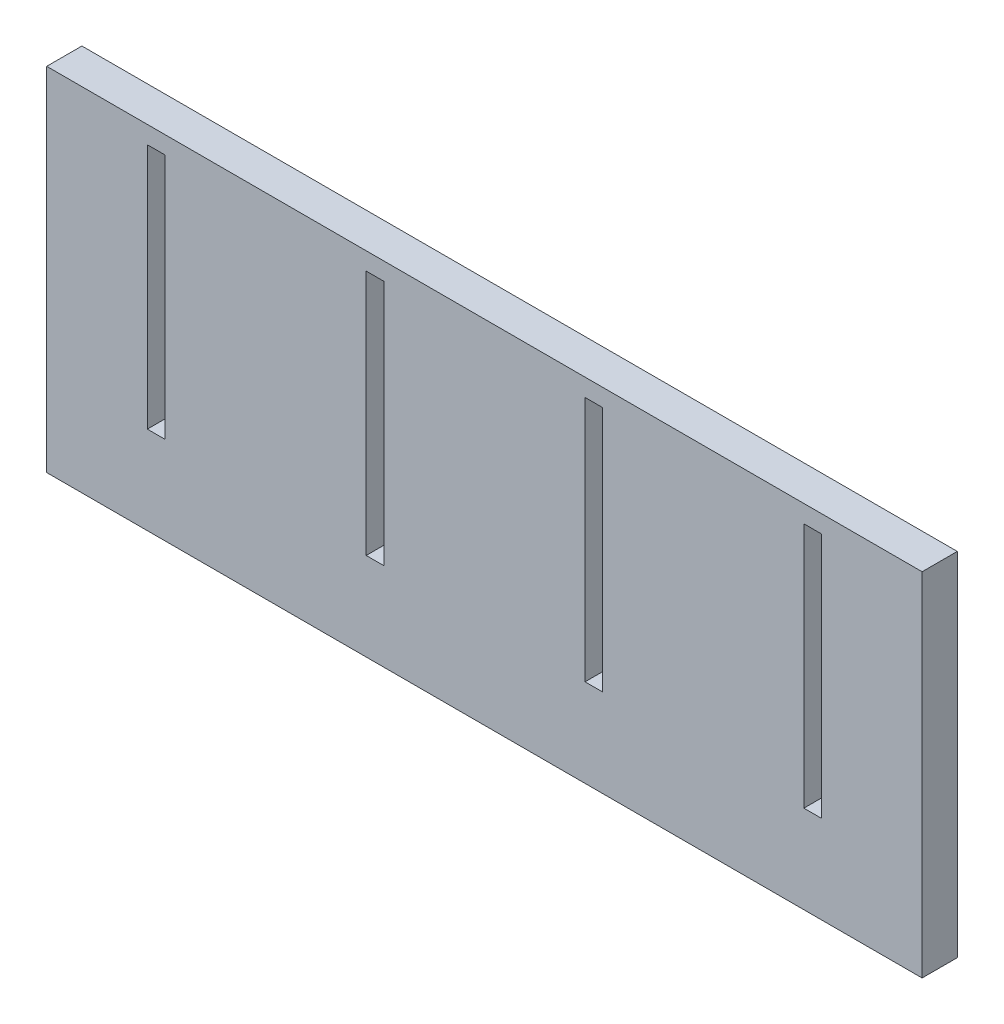
ISO-10303-21;
HEADER;
FILE_DESCRIPTION(('STEP AP214'),'2;1');
FILE_NAME('part.step','',(''),(''),'','','');
FILE_SCHEMA(('AUTOMOTIVE_DESIGN { 1 0 10303 214 1 1 1 1 }'));
ENDSEC;
DATA;
#1=APPLICATION_CONTEXT('core data for automotive mechanical design processes');
#2=APPLICATION_PROTOCOL_DEFINITION('international standard','automotive_design',2000,#1);
#3=PRODUCT_CONTEXT('',#1,'mechanical');
#4=PRODUCT('Part','Part','',(#3));
#5=PRODUCT_RELATED_PRODUCT_CATEGORY('part','',(#4));
#6=PRODUCT_DEFINITION_FORMATION('','',#4);
#7=PRODUCT_DEFINITION_CONTEXT('part definition',#1,'design');
#8=PRODUCT_DEFINITION('design','',#6,#7);
#9=PRODUCT_DEFINITION_SHAPE('','',#8);
#10=(LENGTH_UNIT() NAMED_UNIT(*) SI_UNIT(.MILLI.,.METRE.));
#11=(NAMED_UNIT(*) PLANE_ANGLE_UNIT() SI_UNIT($,.RADIAN.));
#12=(NAMED_UNIT(*) SI_UNIT($,.STERADIAN.) SOLID_ANGLE_UNIT());
#13=UNCERTAINTY_MEASURE_WITH_UNIT(LENGTH_MEASURE(1.E-05),#10,'distance_accuracy_value','');
#14=(GEOMETRIC_REPRESENTATION_CONTEXT(3) GLOBAL_UNCERTAINTY_ASSIGNED_CONTEXT((#13)) GLOBAL_UNIT_ASSIGNED_CONTEXT((#10,
#11,#12)) REPRESENTATION_CONTEXT('',''));
#15=CARTESIAN_POINT('',(0.,0.,0.));
#16=DIRECTION('',(0.,0.,1.));
#17=DIRECTION('',(1.,0.,0.));
#18=AXIS2_PLACEMENT_3D('',#15,#16,#17);
#19=CARTESIAN_POINT('',(33.6070185223817,0.,10.));
#20=DIRECTION('',(1.,0.,0.));
#21=DIRECTION('',(0.,0.,-1.));
#22=AXIS2_PLACEMENT_3D('',#19,#20,#21);
#23=PLANE('',#22);
#24=DIRECTION('',(0.,-1.,0.));
#25=VECTOR('',#24,1.);
#26=CARTESIAN_POINT('',(33.6070185223817,0.,0.));
#27=LINE('',#26,#25);
#28=CARTESIAN_POINT('',(33.6070185223817,-20.7839218912192,0.));
#29=VERTEX_POINT('',#28);
#30=CARTESIAN_POINT('',(33.6070185223817,-90.7839218912192,0.));
#31=VERTEX_POINT('',#30);
#32=EDGE_CURVE('E285',#29,#31,#27,.T.);
#33=ORIENTED_EDGE('',*,*,#32,.T.);
#34=DIRECTION('',(0.,0.,-1.));
#35=VECTOR('',#34,1.);
#36=CARTESIAN_POINT('',(33.6070185223817,-90.7839218912192,10.));
#37=LINE('',#36,#35);
#38=CARTESIAN_POINT('',(33.6070185223817,-90.7839218912192,10.));
#39=VERTEX_POINT('',#38);
#40=EDGE_CURVE('E11',#39,#31,#37,.T.);
#41=ORIENTED_EDGE('',*,*,#40,.F.);
#42=DIRECTION('',(0.,-1.,0.));
#43=VECTOR('',#42,1.);
#44=CARTESIAN_POINT('',(33.6070185223817,0.,10.));
#45=LINE('',#44,#43);
#46=CARTESIAN_POINT('',(33.6070185223817,-20.7839218912192,10.));
#47=VERTEX_POINT('',#46);
#48=EDGE_CURVE('E199',#47,#39,#45,.T.);
#49=ORIENTED_EDGE('',*,*,#48,.F.);
#50=DIRECTION('',(0.,0.,-1.));
#51=VECTOR('',#50,1.);
#52=CARTESIAN_POINT('',(33.6070185223817,-20.7839218912192,10.));
#53=LINE('',#52,#51);
#54=EDGE_CURVE('E67',#47,#29,#53,.T.);
#55=ORIENTED_EDGE('',*,*,#54,.T.);
#56=EDGE_LOOP('',(#33,#41,#49,#55));
#57=FACE_BOUND('',#56,.T.);
#58=ADVANCED_FACE('F47',(#57),#23,.F.);
#59=CARTESIAN_POINT('',(0.,-90.7839218912192,10.));
#60=DIRECTION('',(0.,-1.,0.));
#61=DIRECTION('',(0.,0.,-1.));
#62=AXIS2_PLACEMENT_3D('',#59,#60,#61);
#63=PLANE('',#62);
#64=DIRECTION('',(-1.,0.,0.));
#65=VECTOR('',#64,1.);
#66=CARTESIAN_POINT('',(0.,-90.7839218912192,0.));
#67=LINE('',#66,#65);
#68=CARTESIAN_POINT('',(28.6070185223817,-90.7839218912192,0.));
#69=VERTEX_POINT('',#68);
#70=EDGE_CURVE('E206',#31,#69,#67,.T.);
#71=ORIENTED_EDGE('',*,*,#70,.T.);
#72=DIRECTION('',(0.,0.,-1.));
#73=VECTOR('',#72,1.);
#74=CARTESIAN_POINT('',(28.6070185223817,-90.7839218912192,10.));
#75=LINE('',#74,#73);
#76=CARTESIAN_POINT('',(28.6070185223817,-90.7839218912192,10.));
#77=VERTEX_POINT('',#76);
#78=EDGE_CURVE('E58',#77,#69,#75,.T.);
#79=ORIENTED_EDGE('',*,*,#78,.F.);
#80=DIRECTION('',(-1.,0.,0.));
#81=VECTOR('',#80,1.);
#82=CARTESIAN_POINT('',(0.,-90.7839218912192,10.));
#83=LINE('',#82,#81);
#84=EDGE_CURVE('E193',#39,#77,#83,.T.);
#85=ORIENTED_EDGE('',*,*,#84,.F.);
#86=ORIENTED_EDGE('',*,*,#40,.T.);
#87=EDGE_LOOP('',(#71,#79,#85,#86));
#88=FACE_BOUND('',#87,.T.);
#89=ADVANCED_FACE('F205',(#88),#63,.F.);
#90=CARTESIAN_POINT('',(28.6070185223817,0.,10.));
#91=DIRECTION('',(1.,0.,0.));
#92=DIRECTION('',(0.,1.,0.));
#93=AXIS2_PLACEMENT_3D('',#90,#91,#92);
#94=PLANE('',#93);
#95=DIRECTION('',(0.,-1.,0.));
#96=VECTOR('',#95,1.);
#97=CARTESIAN_POINT('',(28.6070185223817,0.,0.));
#98=LINE('',#97,#96);
#99=CARTESIAN_POINT('',(28.6070185223817,-20.7839218912192,0.));
#100=VERTEX_POINT('',#99);
#101=EDGE_CURVE('E290',#100,#69,#98,.T.);
#102=ORIENTED_EDGE('',*,*,#101,.F.);
#103=DIRECTION('',(0.,0.,-1.));
#104=VECTOR('',#103,1.);
#105=CARTESIAN_POINT('',(28.6070185223817,-20.7839218912192,10.));
#106=LINE('',#105,#104);
#107=CARTESIAN_POINT('',(28.6070185223817,-20.7839218912192,10.));
#108=VERTEX_POINT('',#107);
#109=EDGE_CURVE('E129',#108,#100,#106,.T.);
#110=ORIENTED_EDGE('',*,*,#109,.F.);
#111=DIRECTION('',(0.,-1.,0.));
#112=VECTOR('',#111,1.);
#113=CARTESIAN_POINT('',(28.6070185223817,0.,10.));
#114=LINE('',#113,#112);
#115=EDGE_CURVE('E198',#108,#77,#114,.T.);
#116=ORIENTED_EDGE('',*,*,#115,.T.);
#117=ORIENTED_EDGE('',*,*,#78,.T.);
#118=EDGE_LOOP('',(#102,#110,#116,#117));
#119=FACE_BOUND('',#118,.T.);
#120=ADVANCED_FACE('F211',(#119),#94,.T.);
#121=CARTESIAN_POINT('',(0.,-115.783921891219,10.));
#122=DIRECTION('',(0.,1.,0.));
#123=DIRECTION('',(0.,0.,1.));
#124=AXIS2_PLACEMENT_3D('',#121,#122,#123);
#125=PLANE('',#124);
#126=DIRECTION('',(1.,0.,0.));
#127=VECTOR('',#126,1.);
#128=CARTESIAN_POINT('',(0.,-115.783921891219,0.));
#129=LINE('',#128,#127);
#130=CARTESIAN_POINT('',(-124.392981477618,-115.783921891219,0.));
#131=VERTEX_POINT('',#130);
#132=CARTESIAN_POINT('',(124.407018522382,-115.783921891219,0.));
#133=VERTEX_POINT('',#132);
#134=EDGE_CURVE('E269',#131,#133,#129,.T.);
#135=ORIENTED_EDGE('',*,*,#134,.T.);
#136=DIRECTION('',(0.,0.,-1.));
#137=VECTOR('',#136,1.);
#138=CARTESIAN_POINT('',(124.407018522382,-115.783921891219,10.));
#139=LINE('',#138,#137);
#140=CARTESIAN_POINT('',(124.407018522382,-115.783921891219,10.));
#141=VERTEX_POINT('',#140);
#142=EDGE_CURVE('E300',#141,#133,#139,.T.);
#143=ORIENTED_EDGE('',*,*,#142,.F.);
#144=DIRECTION('',(1.,0.,0.));
#145=VECTOR('',#144,1.);
#146=CARTESIAN_POINT('',(0.,-115.783921891219,10.));
#147=LINE('',#146,#145);
#148=CARTESIAN_POINT('',(-124.392981477618,-115.783921891219,10.));
#149=VERTEX_POINT('',#148);
#150=EDGE_CURVE('E413',#149,#141,#147,.T.);
#151=ORIENTED_EDGE('',*,*,#150,.F.);
#152=DIRECTION('',(0.,0.,-1.));
#153=VECTOR('',#152,1.);
#154=CARTESIAN_POINT('',(-124.392981477618,-115.783921891219,10.));
#155=LINE('',#154,#153);
#156=EDGE_CURVE('E303',#149,#131,#155,.T.);
#157=ORIENTED_EDGE('',*,*,#156,.T.);
#158=EDGE_LOOP('',(#135,#143,#151,#157));
#159=FACE_BOUND('',#158,.T.);
#160=ADVANCED_FACE('F521',(#159),#125,.F.);
#161=CARTESIAN_POINT('',(124.407018522382,0.,10.));
#162=DIRECTION('',(-1.,0.,0.));
#163=DIRECTION('',(0.,0.,1.));
#164=AXIS2_PLACEMENT_3D('',#161,#162,#163);
#165=PLANE('',#164);
#166=DIRECTION('',(0.,1.,0.));
#167=VECTOR('',#166,1.);
#168=CARTESIAN_POINT('',(124.407018522382,0.,0.));
#169=LINE('',#168,#167);
#170=CARTESIAN_POINT('',(124.407018522382,-15.7839218912193,0.));
#171=VERTEX_POINT('',#170);
#172=EDGE_CURVE('E273',#133,#171,#169,.T.);
#173=ORIENTED_EDGE('',*,*,#172,.T.);
#174=DIRECTION('',(0.,0.,-1.));
#175=VECTOR('',#174,1.);
#176=CARTESIAN_POINT('',(124.407018522382,-15.7839218912193,10.));
#177=LINE('',#176,#175);
#178=CARTESIAN_POINT('',(124.407018522382,-15.7839218912193,10.));
#179=VERTEX_POINT('',#178);
#180=EDGE_CURVE('E310',#179,#171,#177,.T.);
#181=ORIENTED_EDGE('',*,*,#180,.F.);
#182=DIRECTION('',(0.,1.,0.));
#183=VECTOR('',#182,1.);
#184=CARTESIAN_POINT('',(124.407018522382,0.,10.));
#185=LINE('',#184,#183);
#186=EDGE_CURVE('E417',#141,#179,#185,.T.);
#187=ORIENTED_EDGE('',*,*,#186,.F.);
#188=ORIENTED_EDGE('',*,*,#142,.T.);
#189=EDGE_LOOP('',(#173,#181,#187,#188));
#190=FACE_BOUND('',#189,.T.);
#191=ADVANCED_FACE('F524',(#190),#165,.F.);
#192=CARTESIAN_POINT('',(0.,-15.7839218912193,10.));
#193=DIRECTION('',(0.,1.,0.));
#194=DIRECTION('',(0.,0.,1.));
#195=AXIS2_PLACEMENT_3D('',#192,#193,#194);
#196=PLANE('',#195);
#197=DIRECTION('',(1.,0.,0.));
#198=VECTOR('',#197,1.);
#199=CARTESIAN_POINT('',(0.,-15.7839218912193,0.));
#200=LINE('',#199,#198);
#201=CARTESIAN_POINT('',(-124.392981477618,-15.7839218912193,0.));
#202=VERTEX_POINT('',#201);
#203=EDGE_CURVE('E277',#202,#171,#200,.T.);
#204=ORIENTED_EDGE('',*,*,#203,.F.);
#205=DIRECTION('',(0.,0.,-1.));
#206=VECTOR('',#205,1.);
#207=CARTESIAN_POINT('',(-124.392981477618,-15.7839218912193,10.));
#208=LINE('',#207,#206);
#209=CARTESIAN_POINT('',(-124.392981477618,-15.7839218912193,10.));
#210=VERTEX_POINT('',#209);
#211=EDGE_CURVE('E306',#210,#202,#208,.T.);
#212=ORIENTED_EDGE('',*,*,#211,.F.);
#213=DIRECTION('',(1.,0.,0.));
#214=VECTOR('',#213,1.);
#215=CARTESIAN_POINT('',(0.,-15.7839218912193,10.));
#216=LINE('',#215,#214);
#217=EDGE_CURVE('E420',#210,#179,#216,.T.);
#218=ORIENTED_EDGE('',*,*,#217,.T.);
#219=ORIENTED_EDGE('',*,*,#180,.T.);
#220=EDGE_LOOP('',(#204,#212,#218,#219));
#221=FACE_BOUND('',#220,.T.);
#222=ADVANCED_FACE('F527',(#221),#196,.T.);
#223=CARTESIAN_POINT('',(-95.7929814776183,0.,10.));
#224=DIRECTION('',(1.,0.,0.));
#225=DIRECTION('',(0.,0.,-1.));
#226=AXIS2_PLACEMENT_3D('',#223,#224,#225);
#227=PLANE('',#226);
#228=DIRECTION('',(0.,-1.,0.));
#229=VECTOR('',#228,1.);
#230=CARTESIAN_POINT('',(-95.7929814776183,0.,0.));
#231=LINE('',#230,#229);
#232=CARTESIAN_POINT('',(-95.7929814776183,-20.7839218912192,0.));
#233=VERTEX_POINT('',#232);
#234=CARTESIAN_POINT('',(-95.7929814776183,-90.7839218912193,0.));
#235=VERTEX_POINT('',#234);
#236=EDGE_CURVE('E253',#233,#235,#231,.T.);
#237=ORIENTED_EDGE('',*,*,#236,.F.);
#238=DIRECTION('',(0.,0.,-1.));
#239=VECTOR('',#238,1.);
#240=CARTESIAN_POINT('',(-95.7929814776183,-20.7839218912192,10.));
#241=LINE('',#240,#239);
#242=CARTESIAN_POINT('',(-95.7929814776183,-20.7839218912192,10.));
#243=VERTEX_POINT('',#242);
#244=EDGE_CURVE('E307',#243,#233,#241,.T.);
#245=ORIENTED_EDGE('',*,*,#244,.F.);
#246=DIRECTION('',(0.,-1.,0.));
#247=VECTOR('',#246,1.);
#248=CARTESIAN_POINT('',(-95.7929814776183,0.,10.));
#249=LINE('',#248,#247);
#250=CARTESIAN_POINT('',(-95.7929814776183,-90.7839218912193,10.));
#251=VERTEX_POINT('',#250);
#252=EDGE_CURVE('E398',#243,#251,#249,.T.);
#253=ORIENTED_EDGE('',*,*,#252,.T.);
#254=DIRECTION('',(0.,0.,-1.));
#255=VECTOR('',#254,1.);
#256=CARTESIAN_POINT('',(-95.7929814776183,-90.7839218912193,10.));
#257=LINE('',#256,#255);
#258=EDGE_CURVE('E316',#251,#235,#257,.T.);
#259=ORIENTED_EDGE('',*,*,#258,.T.);
#260=EDGE_LOOP('',(#237,#245,#253,#259));
#261=FACE_BOUND('',#260,.T.);
#262=ADVANCED_FACE('F555',(#261),#227,.T.);
#263=CARTESIAN_POINT('',(0.,-20.7839218912192,10.));
#264=DIRECTION('',(0.,-1.,0.));
#265=DIRECTION('',(0.,0.,-1.));
#266=AXIS2_PLACEMENT_3D('',#263,#264,#265);
#267=PLANE('',#266);
#268=DIRECTION('',(-1.,0.,0.));
#269=VECTOR('',#268,1.);
#270=CARTESIAN_POINT('',(0.,-20.7839218912192,0.));
#271=LINE('',#270,#269);
#272=CARTESIAN_POINT('',(-90.7929814776183,-20.7839218912192,0.));
#273=VERTEX_POINT('',#272);
#274=EDGE_CURVE('E257',#273,#233,#271,.T.);
#275=ORIENTED_EDGE('',*,*,#274,.F.);
#276=DIRECTION('',(0.,0.,-1.));
#277=VECTOR('',#276,1.);
#278=CARTESIAN_POINT('',(-90.7929814776183,-20.7839218912192,10.));
#279=LINE('',#278,#277);
#280=CARTESIAN_POINT('',(-90.7929814776183,-20.7839218912192,10.));
#281=VERTEX_POINT('',#280);
#282=EDGE_CURVE('E324',#281,#273,#279,.T.);
#283=ORIENTED_EDGE('',*,*,#282,.F.);
#284=DIRECTION('',(-1.,0.,0.));
#285=VECTOR('',#284,1.);
#286=CARTESIAN_POINT('',(0.,-20.7839218912192,10.));
#287=LINE('',#286,#285);
#288=EDGE_CURVE('E402',#281,#243,#287,.T.);
#289=ORIENTED_EDGE('',*,*,#288,.T.);
#290=ORIENTED_EDGE('',*,*,#244,.T.);
#291=EDGE_LOOP('',(#275,#283,#289,#290));
#292=FACE_BOUND('',#291,.T.);
#293=ADVANCED_FACE('F567',(#292),#267,.T.);
#294=CARTESIAN_POINT('',(-90.7929814776183,0.,10.));
#295=DIRECTION('',(1.,0.,0.));
#296=DIRECTION('',(0.,1.,0.));
#297=AXIS2_PLACEMENT_3D('',#294,#295,#296);
#298=PLANE('',#297);
#299=DIRECTION('',(0.,-1.,0.));
#300=VECTOR('',#299,1.);
#301=CARTESIAN_POINT('',(-90.7929814776183,0.,0.));
#302=LINE('',#301,#300);
#303=CARTESIAN_POINT('',(-90.7929814776183,-90.7839218912193,0.));
#304=VERTEX_POINT('',#303);
#305=EDGE_CURVE('E261',#273,#304,#302,.T.);
#306=ORIENTED_EDGE('',*,*,#305,.T.);
#307=DIRECTION('',(0.,0.,-1.));
#308=VECTOR('',#307,1.);
#309=CARTESIAN_POINT('',(-90.7929814776183,-90.7839218912193,10.));
#310=LINE('',#309,#308);
#311=CARTESIAN_POINT('',(-90.7929814776183,-90.7839218912193,10.));
#312=VERTEX_POINT('',#311);
#313=EDGE_CURVE('E319',#312,#304,#310,.T.);
#314=ORIENTED_EDGE('',*,*,#313,.F.);
#315=DIRECTION('',(0.,-1.,0.));
#316=VECTOR('',#315,1.);
#317=CARTESIAN_POINT('',(-90.7929814776183,0.,10.));
#318=LINE('',#317,#316);
#319=EDGE_CURVE('E406',#281,#312,#318,.T.);
#320=ORIENTED_EDGE('',*,*,#319,.F.);
#321=ORIENTED_EDGE('',*,*,#282,.T.);
#322=EDGE_LOOP('',(#306,#314,#320,#321));
#323=FACE_BOUND('',#322,.T.);
#324=ADVANCED_FACE('F563',(#323),#298,.F.);
#325=CARTESIAN_POINT('',(-28.5929814776183,0.,10.));
#326=DIRECTION('',(-1.,0.,0.));
#327=DIRECTION('',(0.,0.,1.));
#328=AXIS2_PLACEMENT_3D('',#325,#326,#327);
#329=PLANE('',#328);
#330=DIRECTION('',(0.,1.,0.));
#331=VECTOR('',#330,1.);
#332=CARTESIAN_POINT('',(-28.5929814776183,0.,0.));
#333=LINE('',#332,#331);
#334=CARTESIAN_POINT('',(-28.5929814776183,-90.7839218912192,0.));
#335=VERTEX_POINT('',#334);
#336=CARTESIAN_POINT('',(-28.5929814776183,-20.7839218912192,0.));
#337=VERTEX_POINT('',#336);
#338=EDGE_CURVE('E237',#335,#337,#333,.T.);
#339=ORIENTED_EDGE('',*,*,#338,.F.);
#340=DIRECTION('',(0.,0.,-1.));
#341=VECTOR('',#340,1.);
#342=CARTESIAN_POINT('',(-28.5929814776183,-90.7839218912192,10.));
#343=LINE('',#342,#341);
#344=CARTESIAN_POINT('',(-28.5929814776183,-90.7839218912192,10.));
#345=VERTEX_POINT('',#344);
#346=EDGE_CURVE('E320',#345,#335,#343,.T.);
#347=ORIENTED_EDGE('',*,*,#346,.F.);
#348=DIRECTION('',(0.,1.,0.));
#349=VECTOR('',#348,1.);
#350=CARTESIAN_POINT('',(-28.5929814776183,0.,10.));
#351=LINE('',#350,#349);
#352=CARTESIAN_POINT('',(-28.5929814776183,-20.7839218912192,10.));
#353=VERTEX_POINT('',#352);
#354=EDGE_CURVE('E375',#345,#353,#351,.T.);
#355=ORIENTED_EDGE('',*,*,#354,.T.);
#356=DIRECTION('',(0.,0.,-1.));
#357=VECTOR('',#356,1.);
#358=CARTESIAN_POINT('',(-28.5929814776183,-20.7839218912192,10.));
#359=LINE('',#358,#357);
#360=EDGE_CURVE('E329',#353,#337,#359,.T.);
#361=ORIENTED_EDGE('',*,*,#360,.T.);
#362=EDGE_LOOP('',(#339,#347,#355,#361));
#363=FACE_BOUND('',#362,.T.);
#364=ADVANCED_FACE('F566',(#363),#329,.T.);
#365=CARTESIAN_POINT('',(0.,-90.7839218912192,10.));
#366=DIRECTION('',(0.,1.,0.));
#367=DIRECTION('',(0.,0.,1.));
#368=AXIS2_PLACEMENT_3D('',#365,#366,#367);
#369=PLANE('',#368);
#370=DIRECTION('',(1.,0.,0.));
#371=VECTOR('',#370,1.);
#372=CARTESIAN_POINT('',(0.,-90.7839218912192,0.));
#373=LINE('',#372,#371);
#374=CARTESIAN_POINT('',(-33.5929814776183,-90.7839218912192,0.));
#375=VERTEX_POINT('',#374);
#376=EDGE_CURVE('E241',#375,#335,#373,.T.);
#377=ORIENTED_EDGE('',*,*,#376,.F.);
#378=DIRECTION('',(0.,0.,-1.));
#379=VECTOR('',#378,1.);
#380=CARTESIAN_POINT('',(-33.5929814776183,-90.7839218912192,10.));
#381=LINE('',#380,#379);
#382=CARTESIAN_POINT('',(-33.5929814776183,-90.7839218912192,10.));
#383=VERTEX_POINT('',#382);
#384=EDGE_CURVE('E336',#383,#375,#381,.T.);
#385=ORIENTED_EDGE('',*,*,#384,.F.);
#386=DIRECTION('',(1.,0.,0.));
#387=VECTOR('',#386,1.);
#388=CARTESIAN_POINT('',(0.,-90.7839218912192,10.));
#389=LINE('',#388,#387);
#390=EDGE_CURVE('E383',#383,#345,#389,.T.);
#391=ORIENTED_EDGE('',*,*,#390,.T.);
#392=ORIENTED_EDGE('',*,*,#346,.T.);
#393=EDGE_LOOP('',(#377,#385,#391,#392));
#394=FACE_BOUND('',#393,.T.);
#395=ADVANCED_FACE('F581',(#394),#369,.T.);
#396=CARTESIAN_POINT('',(-33.5929814776183,0.,10.));
#397=DIRECTION('',(-1.,0.,0.));
#398=DIRECTION('',(0.,0.,1.));
#399=AXIS2_PLACEMENT_3D('',#396,#397,#398);
#400=PLANE('',#399);
#401=DIRECTION('',(0.,1.,0.));
#402=VECTOR('',#401,1.);
#403=CARTESIAN_POINT('',(-33.5929814776183,0.,0.));
#404=LINE('',#403,#402);
#405=CARTESIAN_POINT('',(-33.5929814776183,-20.7839218912192,0.));
#406=VERTEX_POINT('',#405);
#407=EDGE_CURVE('E245',#375,#406,#404,.T.);
#408=ORIENTED_EDGE('',*,*,#407,.T.);
#409=DIRECTION('',(0.,0.,-1.));
#410=VECTOR('',#409,1.);
#411=CARTESIAN_POINT('',(-33.5929814776183,-20.7839218912192,10.));
#412=LINE('',#411,#410);
#413=CARTESIAN_POINT('',(-33.5929814776183,-20.7839218912192,10.));
#414=VERTEX_POINT('',#413);
#415=EDGE_CURVE('E332',#414,#406,#412,.T.);
#416=ORIENTED_EDGE('',*,*,#415,.F.);
#417=DIRECTION('',(0.,1.,0.));
#418=VECTOR('',#417,1.);
#419=CARTESIAN_POINT('',(-33.5929814776183,0.,10.));
#420=LINE('',#419,#418);
#421=EDGE_CURVE('E391',#383,#414,#420,.T.);
#422=ORIENTED_EDGE('',*,*,#421,.F.);
#423=ORIENTED_EDGE('',*,*,#384,.T.);
#424=EDGE_LOOP('',(#408,#416,#422,#423));
#425=FACE_BOUND('',#424,.T.);
#426=ADVANCED_FACE('F578',(#425),#400,.F.);
#427=CARTESIAN_POINT('',(95.8070185223817,0.,10.));
#428=DIRECTION('',(-1.,0.,0.));
#429=DIRECTION('',(0.,0.,1.));
#430=AXIS2_PLACEMENT_3D('',#427,#428,#429);
#431=PLANE('',#430);
#432=DIRECTION('',(0.,1.,0.));
#433=VECTOR('',#432,1.);
#434=CARTESIAN_POINT('',(95.8070185223817,0.,0.));
#435=LINE('',#434,#433);
#436=CARTESIAN_POINT('',(95.8070185223817,-90.7839218912192,0.));
#437=VERTEX_POINT('',#436);
#438=CARTESIAN_POINT('',(95.8070185223817,-20.7839218912192,0.));
#439=VERTEX_POINT('',#438);
#440=EDGE_CURVE('E222',#437,#439,#435,.T.);
#441=ORIENTED_EDGE('',*,*,#440,.F.);
#442=DIRECTION('',(0.,0.,-1.));
#443=VECTOR('',#442,1.);
#444=CARTESIAN_POINT('',(95.8070185223817,-90.7839218912192,10.));
#445=LINE('',#444,#443);
#446=CARTESIAN_POINT('',(95.8070185223817,-90.7839218912192,10.));
#447=VERTEX_POINT('',#446);
#448=EDGE_CURVE('E51',#447,#437,#445,.T.);
#449=ORIENTED_EDGE('',*,*,#448,.F.);
#450=DIRECTION('',(0.,1.,0.));
#451=VECTOR('',#450,1.);
#452=CARTESIAN_POINT('',(95.8070185223817,0.,10.));
#453=LINE('',#452,#451);
#454=CARTESIAN_POINT('',(95.8070185223817,-20.7839218912192,10.));
#455=VERTEX_POINT('',#454);
#456=EDGE_CURVE('E297',#447,#455,#453,.T.);
#457=ORIENTED_EDGE('',*,*,#456,.T.);
#458=DIRECTION('',(0.,0.,-1.));
#459=VECTOR('',#458,1.);
#460=CARTESIAN_POINT('',(95.8070185223817,-20.7839218912192,10.));
#461=LINE('',#460,#459);
#462=EDGE_CURVE('E218',#455,#439,#461,.T.);
#463=ORIENTED_EDGE('',*,*,#462,.T.);
#464=EDGE_LOOP('',(#441,#449,#457,#463));
#465=FACE_BOUND('',#464,.T.);
#466=ADVANCED_FACE('F49',(#465),#431,.T.);
#467=CARTESIAN_POINT('',(2.5197600087351E-13,-90.7839218912195,10.));
#468=DIRECTION('',(0.,1.,0.));
#469=DIRECTION('',(-1.,0.,0.));
#470=AXIS2_PLACEMENT_3D('',#467,#468,#469);
#471=PLANE('',#470);
#472=DIRECTION('',(1.,0.,0.));
#473=VECTOR('',#472,1.);
#474=CARTESIAN_POINT('',(2.5197600087351E-13,-90.7839218912195,0.));
#475=LINE('',#474,#473);
#476=CARTESIAN_POINT('',(90.8070185223817,-90.7839218912192,0.));
#477=VERTEX_POINT('',#476);
#478=EDGE_CURVE('E226',#477,#437,#475,.T.);
#479=ORIENTED_EDGE('',*,*,#478,.F.);
#480=DIRECTION('',(0.,0.,-1.));
#481=VECTOR('',#480,1.);
#482=CARTESIAN_POINT('',(90.8070185223817,-90.7839218912192,10.));
#483=LINE('',#482,#481);
#484=CARTESIAN_POINT('',(90.8070185223817,-90.7839218912192,10.));
#485=VERTEX_POINT('',#484);
#486=EDGE_CURVE('E346',#485,#477,#483,.T.);
#487=ORIENTED_EDGE('',*,*,#486,.F.);
#488=DIRECTION('',(1.,0.,0.));
#489=VECTOR('',#488,1.);
#490=CARTESIAN_POINT('',(2.5197600087351E-13,-90.7839218912195,10.));
#491=LINE('',#490,#489);
#492=EDGE_CURVE('E361',#485,#447,#491,.T.);
#493=ORIENTED_EDGE('',*,*,#492,.T.);
#494=ORIENTED_EDGE('',*,*,#448,.T.);
#495=EDGE_LOOP('',(#479,#487,#493,#494));
#496=FACE_BOUND('',#495,.T.);
#497=ADVANCED_FACE('F359',(#496),#471,.T.);
#498=CARTESIAN_POINT('',(90.8070185223817,0.,10.));
#499=DIRECTION('',(-1.,0.,0.));
#500=DIRECTION('',(0.,-1.,0.));
#501=AXIS2_PLACEMENT_3D('',#498,#499,#500);
#502=PLANE('',#501);
#503=DIRECTION('',(0.,1.,0.));
#504=VECTOR('',#503,1.);
#505=CARTESIAN_POINT('',(90.8070185223817,0.,0.));
#506=LINE('',#505,#504);
#507=CARTESIAN_POINT('',(90.8070185223817,-20.7839218912192,0.));
#508=VERTEX_POINT('',#507);
#509=EDGE_CURVE('E230',#477,#508,#506,.T.);
#510=ORIENTED_EDGE('',*,*,#509,.T.);
#511=DIRECTION('',(0.,0.,-1.));
#512=VECTOR('',#511,1.);
#513=CARTESIAN_POINT('',(90.8070185223817,-20.7839218912192,10.));
#514=LINE('',#513,#512);
#515=CARTESIAN_POINT('',(90.8070185223817,-20.7839218912192,10.));
#516=VERTEX_POINT('',#515);
#517=EDGE_CURVE('E343',#516,#508,#514,.T.);
#518=ORIENTED_EDGE('',*,*,#517,.F.);
#519=DIRECTION('',(0.,1.,0.));
#520=VECTOR('',#519,1.);
#521=CARTESIAN_POINT('',(90.8070185223817,0.,10.));
#522=LINE('',#521,#520);
#523=EDGE_CURVE('E376',#485,#516,#522,.T.);
#524=ORIENTED_EDGE('',*,*,#523,.F.);
#525=ORIENTED_EDGE('',*,*,#486,.T.);
#526=EDGE_LOOP('',(#510,#518,#524,#525));
#527=FACE_BOUND('',#526,.T.);
#528=ADVANCED_FACE('F368',(#527),#502,.F.);
#529=CARTESIAN_POINT('',(-124.392981477618,0.,10.));
#530=DIRECTION('',(-1.,0.,0.));
#531=DIRECTION('',(0.,0.,1.));
#532=AXIS2_PLACEMENT_3D('',#529,#530,#531);
#533=PLANE('',#532);
#534=DIRECTION('',(0.,1.,0.));
#535=VECTOR('',#534,1.);
#536=CARTESIAN_POINT('',(-124.392981477618,0.,0.));
#537=LINE('',#536,#535);
#538=EDGE_CURVE('E281',#131,#202,#537,.T.);
#539=ORIENTED_EDGE('',*,*,#538,.F.);
#540=ORIENTED_EDGE('',*,*,#156,.F.);
#541=DIRECTION('',(0.,1.,0.));
#542=VECTOR('',#541,1.);
#543=CARTESIAN_POINT('',(-124.392981477618,0.,10.));
#544=LINE('',#543,#542);
#545=EDGE_CURVE('E424',#149,#210,#544,.T.);
#546=ORIENTED_EDGE('',*,*,#545,.T.);
#547=ORIENTED_EDGE('',*,*,#211,.T.);
#548=EDGE_LOOP('',(#539,#540,#546,#547));
#549=FACE_BOUND('',#548,.T.);
#550=ADVANCED_FACE('F530',(#549),#533,.T.);
#551=CARTESIAN_POINT('',(0.,-90.7839218912193,10.));
#552=DIRECTION('',(0.,-1.,0.));
#553=DIRECTION('',(0.,0.,-1.));
#554=AXIS2_PLACEMENT_3D('',#551,#552,#553);
#555=PLANE('',#554);
#556=DIRECTION('',(-1.,0.,0.));
#557=VECTOR('',#556,1.);
#558=CARTESIAN_POINT('',(0.,-90.7839218912193,0.));
#559=LINE('',#558,#557);
#560=EDGE_CURVE('E265',#304,#235,#559,.T.);
#561=ORIENTED_EDGE('',*,*,#560,.T.);
#562=ORIENTED_EDGE('',*,*,#258,.F.);
#563=DIRECTION('',(-1.,0.,0.));
#564=VECTOR('',#563,1.);
#565=CARTESIAN_POINT('',(0.,-90.7839218912193,10.));
#566=LINE('',#565,#564);
#567=EDGE_CURVE('E410',#312,#251,#566,.T.);
#568=ORIENTED_EDGE('',*,*,#567,.F.);
#569=ORIENTED_EDGE('',*,*,#313,.T.);
#570=EDGE_LOOP('',(#561,#562,#568,#569));
#571=FACE_BOUND('',#570,.T.);
#572=ADVANCED_FACE('F552',(#571),#555,.F.);
#573=CARTESIAN_POINT('',(0.,-20.7839218912192,10.));
#574=DIRECTION('',(0.,1.,0.));
#575=DIRECTION('',(0.,0.,1.));
#576=AXIS2_PLACEMENT_3D('',#573,#574,#575);
#577=PLANE('',#576);
#578=DIRECTION('',(1.,0.,0.));
#579=VECTOR('',#578,1.);
#580=CARTESIAN_POINT('',(0.,-20.7839218912192,0.));
#581=LINE('',#580,#579);
#582=EDGE_CURVE('E249',#406,#337,#581,.T.);
#583=ORIENTED_EDGE('',*,*,#582,.T.);
#584=ORIENTED_EDGE('',*,*,#360,.F.);
#585=DIRECTION('',(1.,0.,0.));
#586=VECTOR('',#585,1.);
#587=CARTESIAN_POINT('',(0.,-20.7839218912192,10.));
#588=LINE('',#587,#586);
#589=EDGE_CURVE('E395',#414,#353,#588,.T.);
#590=ORIENTED_EDGE('',*,*,#589,.F.);
#591=ORIENTED_EDGE('',*,*,#415,.T.);
#592=EDGE_LOOP('',(#583,#584,#590,#591));
#593=FACE_BOUND('',#592,.T.);
#594=ADVANCED_FACE('F540',(#593),#577,.F.);
#595=CARTESIAN_POINT('',(0.,-20.7839218912192,10.));
#596=DIRECTION('',(0.,1.,0.));
#597=DIRECTION('',(0.,0.,1.));
#598=AXIS2_PLACEMENT_3D('',#595,#596,#597);
#599=PLANE('',#598);
#600=DIRECTION('',(1.,0.,0.));
#601=VECTOR('',#600,1.);
#602=CARTESIAN_POINT('',(0.,-20.7839218912192,0.));
#603=LINE('',#602,#601);
#604=EDGE_CURVE('E233',#508,#439,#603,.T.);
#605=ORIENTED_EDGE('',*,*,#604,.T.);
#606=ORIENTED_EDGE('',*,*,#462,.F.);
#607=DIRECTION('',(1.,0.,0.));
#608=VECTOR('',#607,1.);
#609=CARTESIAN_POINT('',(0.,-20.7839218912192,10.));
#610=LINE('',#609,#608);
#611=EDGE_CURVE('E372',#516,#455,#610,.T.);
#612=ORIENTED_EDGE('',*,*,#611,.F.);
#613=ORIENTED_EDGE('',*,*,#517,.T.);
#614=EDGE_LOOP('',(#605,#606,#612,#613));
#615=FACE_BOUND('',#614,.T.);
#616=ADVANCED_FACE('F371',(#615),#599,.F.);
#617=CARTESIAN_POINT('',(0.,-20.7839218912192,10.));
#618=DIRECTION('',(0.,-1.,0.));
#619=DIRECTION('',(0.,0.,-1.));
#620=AXIS2_PLACEMENT_3D('',#617,#618,#619);
#621=PLANE('',#620);
#622=DIRECTION('',(-1.,0.,0.));
#623=VECTOR('',#622,1.);
#624=CARTESIAN_POINT('',(0.,-20.7839218912192,0.));
#625=LINE('',#624,#623);
#626=EDGE_CURVE('E293',#29,#100,#625,.T.);
#627=ORIENTED_EDGE('',*,*,#626,.F.);
#628=ORIENTED_EDGE('',*,*,#54,.F.);
#629=DIRECTION('',(-1.,0.,0.));
#630=VECTOR('',#629,1.);
#631=CARTESIAN_POINT('',(0.,-20.7839218912192,10.));
#632=LINE('',#631,#630);
#633=EDGE_CURVE('E213',#47,#108,#632,.T.);
#634=ORIENTED_EDGE('',*,*,#633,.T.);
#635=ORIENTED_EDGE('',*,*,#109,.T.);
#636=EDGE_LOOP('',(#627,#628,#634,#635));
#637=FACE_BOUND('',#636,.T.);
#638=ADVANCED_FACE('F507',(#637),#621,.T.);
#639=CARTESIAN_POINT('',(0.,0.,10.));
#640=DIRECTION('',(0.,0.,1.));
#641=DIRECTION('',(1.,0.,0.));
#642=AXIS2_PLACEMENT_3D('',#639,#640,#641);
#643=PLANE('',#642);
#644=ORIENTED_EDGE('',*,*,#456,.F.);
#645=ORIENTED_EDGE('',*,*,#492,.F.);
#646=ORIENTED_EDGE('',*,*,#523,.T.);
#647=ORIENTED_EDGE('',*,*,#611,.T.);
#648=EDGE_LOOP('',(#644,#645,#646,#647));
#649=FACE_BOUND('',#648,.T.);
#650=ORIENTED_EDGE('',*,*,#354,.F.);
#651=ORIENTED_EDGE('',*,*,#390,.F.);
#652=ORIENTED_EDGE('',*,*,#421,.T.);
#653=ORIENTED_EDGE('',*,*,#589,.T.);
#654=EDGE_LOOP('',(#650,#651,#652,#653));
#655=FACE_BOUND('',#654,.T.);
#656=ORIENTED_EDGE('',*,*,#252,.F.);
#657=ORIENTED_EDGE('',*,*,#288,.F.);
#658=ORIENTED_EDGE('',*,*,#319,.T.);
#659=ORIENTED_EDGE('',*,*,#567,.T.);
#660=EDGE_LOOP('',(#656,#657,#658,#659));
#661=FACE_BOUND('',#660,.T.);
#662=ORIENTED_EDGE('',*,*,#150,.T.);
#663=ORIENTED_EDGE('',*,*,#186,.T.);
#664=ORIENTED_EDGE('',*,*,#217,.F.);
#665=ORIENTED_EDGE('',*,*,#545,.F.);
#666=EDGE_LOOP('',(#662,#663,#664,#665));
#667=FACE_BOUND('',#666,.T.);
#668=ORIENTED_EDGE('',*,*,#48,.T.);
#669=ORIENTED_EDGE('',*,*,#84,.T.);
#670=ORIENTED_EDGE('',*,*,#115,.F.);
#671=ORIENTED_EDGE('',*,*,#633,.F.);
#672=EDGE_LOOP('',(#668,#669,#670,#671));
#673=FACE_BOUND('',#672,.T.);
#674=ADVANCED_FACE('F195',(#649,#655,#661,#667,#673),#643,.T.);
#675=CARTESIAN_POINT('',(0.,0.,0.));
#676=DIRECTION('',(0.,0.,1.));
#677=DIRECTION('',(1.,0.,0.));
#678=AXIS2_PLACEMENT_3D('',#675,#676,#677);
#679=PLANE('',#678);
#680=ORIENTED_EDGE('',*,*,#440,.T.);
#681=ORIENTED_EDGE('',*,*,#604,.F.);
#682=ORIENTED_EDGE('',*,*,#509,.F.);
#683=ORIENTED_EDGE('',*,*,#478,.T.);
#684=EDGE_LOOP('',(#680,#681,#682,#683));
#685=FACE_BOUND('',#684,.T.);
#686=ORIENTED_EDGE('',*,*,#338,.T.);
#687=ORIENTED_EDGE('',*,*,#582,.F.);
#688=ORIENTED_EDGE('',*,*,#407,.F.);
#689=ORIENTED_EDGE('',*,*,#376,.T.);
#690=EDGE_LOOP('',(#686,#687,#688,#689));
#691=FACE_BOUND('',#690,.T.);
#692=ORIENTED_EDGE('',*,*,#236,.T.);
#693=ORIENTED_EDGE('',*,*,#560,.F.);
#694=ORIENTED_EDGE('',*,*,#305,.F.);
#695=ORIENTED_EDGE('',*,*,#274,.T.);
#696=EDGE_LOOP('',(#692,#693,#694,#695));
#697=FACE_BOUND('',#696,.T.);
#698=ORIENTED_EDGE('',*,*,#134,.F.);
#699=ORIENTED_EDGE('',*,*,#538,.T.);
#700=ORIENTED_EDGE('',*,*,#203,.T.);
#701=ORIENTED_EDGE('',*,*,#172,.F.);
#702=EDGE_LOOP('',(#698,#699,#700,#701));
#703=FACE_BOUND('',#702,.T.);
#704=ORIENTED_EDGE('',*,*,#32,.F.);
#705=ORIENTED_EDGE('',*,*,#626,.T.);
#706=ORIENTED_EDGE('',*,*,#101,.T.);
#707=ORIENTED_EDGE('',*,*,#70,.F.);
#708=EDGE_LOOP('',(#704,#705,#706,#707));
#709=FACE_BOUND('',#708,.T.);
#710=ADVANCED_FACE('F365',(#685,#691,#697,#703,#709),#679,.F.);
#711=CLOSED_SHELL('',(#58,#89,#120,#160,#191,#222,#262,#293,#324,#364,#395,#426,#466,#497,#528,
#550,#572,#594,#616,#638,#674,#710));
#712=MANIFOLD_SOLID_BREP('B2',#711);
#713=ADVANCED_BREP_SHAPE_REPRESENTATION('',(#18,#712),#14);
#714=SHAPE_DEFINITION_REPRESENTATION(#9,#713);
ENDSEC;
END-ISO-10303-21;
